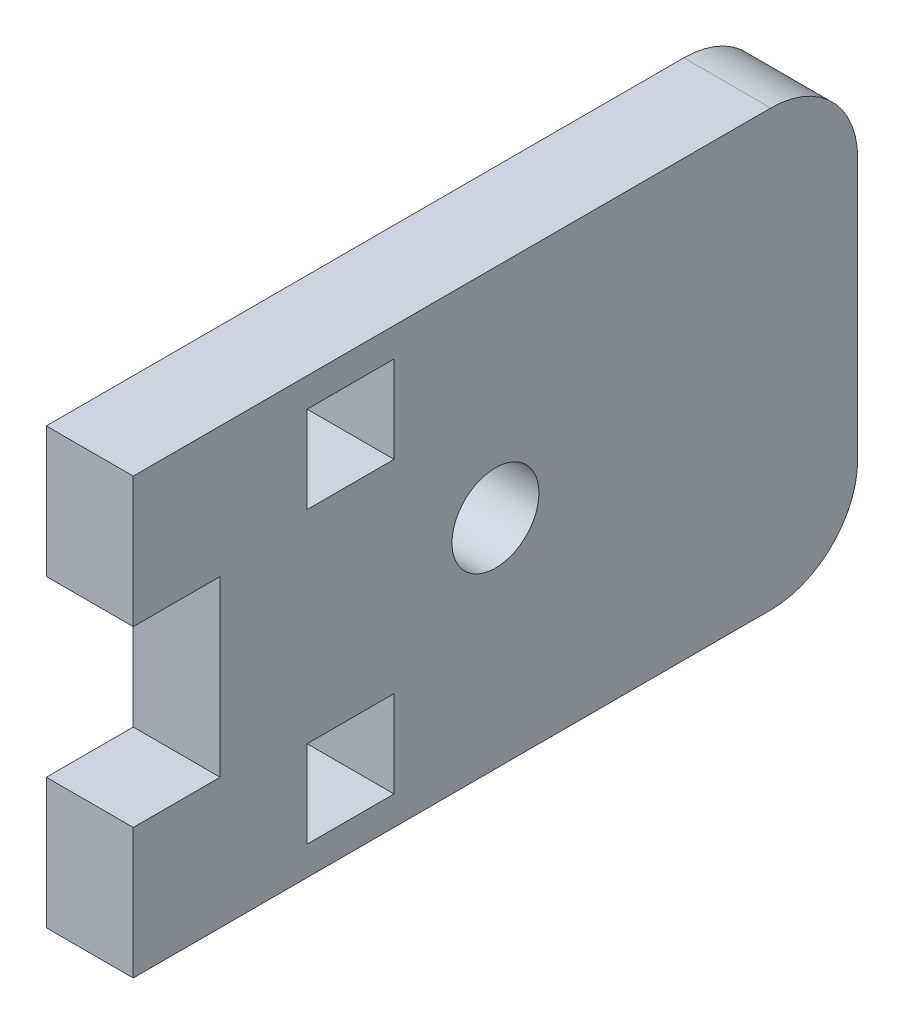
ISO-10303-21;
HEADER;
FILE_DESCRIPTION(('STEP AP214'),'2;1');
FILE_NAME('part.step','',(''),(''),'','','');
FILE_SCHEMA(('AUTOMOTIVE_DESIGN { 1 0 10303 214 1 1 1 1 }'));
ENDSEC;
DATA;
#1=APPLICATION_CONTEXT('core data for automotive mechanical design processes');
#2=APPLICATION_PROTOCOL_DEFINITION('international standard','automotive_design',2000,#1);
#3=PRODUCT_CONTEXT('',#1,'mechanical');
#4=PRODUCT('Part','Part','',(#3));
#5=PRODUCT_RELATED_PRODUCT_CATEGORY('part','',(#4));
#6=PRODUCT_DEFINITION_FORMATION('','',#4);
#7=PRODUCT_DEFINITION_CONTEXT('part definition',#1,'design');
#8=PRODUCT_DEFINITION('design','',#6,#7);
#9=PRODUCT_DEFINITION_SHAPE('','',#8);
#10=(LENGTH_UNIT() NAMED_UNIT(*) SI_UNIT(.MILLI.,.METRE.));
#11=(NAMED_UNIT(*) PLANE_ANGLE_UNIT() SI_UNIT($,.RADIAN.));
#12=(NAMED_UNIT(*) SI_UNIT($,.STERADIAN.) SOLID_ANGLE_UNIT());
#13=UNCERTAINTY_MEASURE_WITH_UNIT(LENGTH_MEASURE(1.E-05),#10,'distance_accuracy_value','');
#14=(GEOMETRIC_REPRESENTATION_CONTEXT(3) GLOBAL_UNCERTAINTY_ASSIGNED_CONTEXT((#13)) GLOBAL_UNIT_ASSIGNED_CONTEXT((#10,
#11,#12)) REPRESENTATION_CONTEXT('',''));
#15=CARTESIAN_POINT('',(0.,0.,0.));
#16=DIRECTION('',(0.,0.,1.));
#17=DIRECTION('',(1.,0.,0.));
#18=AXIS2_PLACEMENT_3D('',#15,#16,#17);
#19=CARTESIAN_POINT('',(3.,0.,0.));
#20=DIRECTION('',(1.,0.,0.));
#21=DIRECTION('',(0.,0.,-1.));
#22=AXIS2_PLACEMENT_3D('',#19,#20,#21);
#23=PLANE('',#22);
#24=DIRECTION('',(0.,0.,1.));
#25=VECTOR('',#24,1.);
#26=CARTESIAN_POINT('',(3.,-3.5,6.5));
#27=LINE('',#26,#25);
#28=CARTESIAN_POINT('',(3.,-3.5,3.5));
#29=VERTEX_POINT('',#28);
#30=CARTESIAN_POINT('',(3.,-3.5,6.5));
#31=VERTEX_POINT('',#30);
#32=EDGE_CURVE('E168',#29,#31,#27,.T.);
#33=ORIENTED_EDGE('',*,*,#32,.F.);
#34=DIRECTION('',(0.,1.,0.));
#35=VECTOR('',#34,1.);
#36=CARTESIAN_POINT('',(3.,-3.5,3.5));
#37=LINE('',#36,#35);
#38=CARTESIAN_POINT('',(3.,-6.5,3.5));
#39=VERTEX_POINT('',#38);
#40=EDGE_CURVE('E186',#39,#29,#37,.T.);
#41=ORIENTED_EDGE('',*,*,#40,.F.);
#42=DIRECTION('',(0.,0.,-1.));
#43=VECTOR('',#42,1.);
#44=CARTESIAN_POINT('',(3.,-6.5,6.5));
#45=LINE('',#44,#43);
#46=CARTESIAN_POINT('',(3.,-6.5,6.5));
#47=VERTEX_POINT('',#46);
#48=EDGE_CURVE('E189',#47,#39,#45,.T.);
#49=ORIENTED_EDGE('',*,*,#48,.F.);
#50=DIRECTION('',(0.,-1.,0.));
#51=VECTOR('',#50,1.);
#52=CARTESIAN_POINT('',(3.,-3.5,6.5));
#53=LINE('',#52,#51);
#54=EDGE_CURVE('E195',#31,#47,#53,.T.);
#55=ORIENTED_EDGE('',*,*,#54,.F.);
#56=EDGE_LOOP('',(#33,#41,#49,#55));
#57=FACE_BOUND('',#56,.T.);
#58=DIRECTION('',(0.,0.,1.));
#59=VECTOR('',#58,1.);
#60=CARTESIAN_POINT('',(3.,6.5,6.5));
#61=LINE('',#60,#59);
#62=CARTESIAN_POINT('',(3.,6.5,3.5));
#63=VERTEX_POINT('',#62);
#64=CARTESIAN_POINT('',(3.,6.5,6.5));
#65=VERTEX_POINT('',#64);
#66=EDGE_CURVE('E201',#63,#65,#61,.T.);
#67=ORIENTED_EDGE('',*,*,#66,.F.);
#68=DIRECTION('',(0.,1.,0.));
#69=VECTOR('',#68,1.);
#70=CARTESIAN_POINT('',(3.,6.5,3.5));
#71=LINE('',#70,#69);
#72=CARTESIAN_POINT('',(3.,3.5,3.5));
#73=VERTEX_POINT('',#72);
#74=EDGE_CURVE('E209',#73,#63,#71,.T.);
#75=ORIENTED_EDGE('',*,*,#74,.F.);
#76=DIRECTION('',(0.,0.,-1.));
#77=VECTOR('',#76,1.);
#78=CARTESIAN_POINT('',(3.,3.5,6.5));
#79=LINE('',#78,#77);
#80=CARTESIAN_POINT('',(3.,3.5,6.5));
#81=VERTEX_POINT('',#80);
#82=EDGE_CURVE('E223',#81,#73,#79,.T.);
#83=ORIENTED_EDGE('',*,*,#82,.F.);
#84=DIRECTION('',(0.,-1.,0.));
#85=VECTOR('',#84,1.);
#86=CARTESIAN_POINT('',(3.,6.5,6.5));
#87=LINE('',#86,#85);
#88=EDGE_CURVE('E220',#65,#81,#87,.T.);
#89=ORIENTED_EDGE('',*,*,#88,.F.);
#90=EDGE_LOOP('',(#67,#75,#83,#89));
#91=FACE_BOUND('',#90,.T.);
#92=DIRECTION('',(0.,0.,-1.));
#93=VECTOR('',#92,1.);
#94=CARTESIAN_POINT('',(3.,-7.5,12.5));
#95=LINE('',#94,#93);
#96=CARTESIAN_POINT('',(3.,-7.5,12.5));
#97=VERTEX_POINT('',#96);
#98=CARTESIAN_POINT('',(3.,-7.5,-9.5));
#99=VERTEX_POINT('',#98);
#100=EDGE_CURVE('E258',#97,#99,#95,.T.);
#101=ORIENTED_EDGE('',*,*,#100,.T.);
#102=CARTESIAN_POINT('',(3.,-4.5,-9.5));
#103=DIRECTION('',(1.,0.,0.));
#104=DIRECTION('',(0.,0.,-1.));
#105=AXIS2_PLACEMENT_3D('',#102,#103,#104);
#106=CIRCLE('',#105,3.);
#107=CARTESIAN_POINT('',(3.,-4.5,-12.5));
#108=VERTEX_POINT('',#107);
#109=EDGE_CURVE('E41',#99,#108,#106,.T.);
#110=ORIENTED_EDGE('',*,*,#109,.T.);
#111=DIRECTION('',(0.,1.,0.));
#112=VECTOR('',#111,1.);
#113=CARTESIAN_POINT('',(3.,7.5,-12.5));
#114=LINE('',#113,#112);
#115=CARTESIAN_POINT('',(3.,4.5,-12.5));
#116=VERTEX_POINT('',#115);
#117=EDGE_CURVE('E243',#108,#116,#114,.T.);
#118=ORIENTED_EDGE('',*,*,#117,.T.);
#119=CARTESIAN_POINT('',(3.,4.5,-9.5));
#120=DIRECTION('',(1.,0.,0.));
#121=DIRECTION('',(0.,0.,-1.));
#122=AXIS2_PLACEMENT_3D('',#119,#120,#121);
#123=CIRCLE('',#122,3.);
#124=CARTESIAN_POINT('',(3.,7.5,-9.5));
#125=VERTEX_POINT('',#124);
#126=EDGE_CURVE('E48',#116,#125,#123,.T.);
#127=ORIENTED_EDGE('',*,*,#126,.T.);
#128=DIRECTION('',(0.,0.,1.));
#129=VECTOR('',#128,1.);
#130=CARTESIAN_POINT('',(3.,7.5,12.5));
#131=LINE('',#130,#129);
#132=CARTESIAN_POINT('',(3.,7.5,12.5));
#133=VERTEX_POINT('',#132);
#134=EDGE_CURVE('E245',#125,#133,#131,.T.);
#135=ORIENTED_EDGE('',*,*,#134,.T.);
#136=DIRECTION('',(0.,-1.,0.));
#137=VECTOR('',#136,1.);
#138=CARTESIAN_POINT('',(3.,3.,12.5));
#139=LINE('',#138,#137);
#140=CARTESIAN_POINT('',(3.,3.,12.5));
#141=VERTEX_POINT('',#140);
#142=EDGE_CURVE('E248',#133,#141,#139,.T.);
#143=ORIENTED_EDGE('',*,*,#142,.T.);
#144=DIRECTION('',(0.,0.,-1.));
#145=VECTOR('',#144,1.);
#146=CARTESIAN_POINT('',(3.,3.,9.50000000000001));
#147=LINE('',#146,#145);
#148=CARTESIAN_POINT('',(3.,3.,9.50000000000001));
#149=VERTEX_POINT('',#148);
#150=EDGE_CURVE('E250',#141,#149,#147,.T.);
#151=ORIENTED_EDGE('',*,*,#150,.T.);
#152=DIRECTION('',(0.,-1.,0.));
#153=VECTOR('',#152,1.);
#154=CARTESIAN_POINT('',(3.,-3.,9.50000000000001));
#155=LINE('',#154,#153);
#156=CARTESIAN_POINT('',(3.,-3.,9.50000000000001));
#157=VERTEX_POINT('',#156);
#158=EDGE_CURVE('E252',#149,#157,#155,.T.);
#159=ORIENTED_EDGE('',*,*,#158,.T.);
#160=DIRECTION('',(0.,0.,1.));
#161=VECTOR('',#160,1.);
#162=CARTESIAN_POINT('',(3.,-3.,12.5));
#163=LINE('',#162,#161);
#164=CARTESIAN_POINT('',(3.,-3.,12.5));
#165=VERTEX_POINT('',#164);
#166=EDGE_CURVE('E254',#157,#165,#163,.T.);
#167=ORIENTED_EDGE('',*,*,#166,.T.);
#168=DIRECTION('',(0.,-1.,0.));
#169=VECTOR('',#168,1.);
#170=CARTESIAN_POINT('',(3.,-7.5,12.5));
#171=LINE('',#170,#169);
#172=EDGE_CURVE('E256',#165,#97,#171,.T.);
#173=ORIENTED_EDGE('',*,*,#172,.T.);
#174=EDGE_LOOP('',(#101,#110,#118,#127,#135,#143,#151,#159,#167,#173));
#175=FACE_BOUND('',#174,.T.);
#176=CARTESIAN_POINT('',(3.,0.,0.));
#177=DIRECTION('',(1.,0.,0.));
#178=DIRECTION('',(0.,0.,-1.));
#179=AXIS2_PLACEMENT_3D('',#176,#177,#178);
#180=CIRCLE('',#179,1.5);
#181=CARTESIAN_POINT('',(3.,0.,-1.5));
#182=VERTEX_POINT('',#181);
#183=EDGE_CURVE('E237',#182,#182,#180,.T.);
#184=ORIENTED_EDGE('',*,*,#183,.F.);
#185=EDGE_LOOP('',(#184));
#186=FACE_BOUND('',#185,.T.);
#187=ADVANCED_FACE('F33',(#57,#91,#175,#186),#23,.T.);
#188=CARTESIAN_POINT('',(0.,0.,0.));
#189=DIRECTION('',(1.,0.,0.));
#190=DIRECTION('',(0.,0.,-1.));
#191=AXIS2_PLACEMENT_3D('',#188,#189,#190);
#192=PLANE('',#191);
#193=DIRECTION('',(0.,1.,0.));
#194=VECTOR('',#193,1.);
#195=CARTESIAN_POINT('',(0.,-3.5,3.5));
#196=LINE('',#195,#194);
#197=CARTESIAN_POINT('',(0.,-6.5,3.5));
#198=VERTEX_POINT('',#197);
#199=CARTESIAN_POINT('',(0.,-3.5,3.5));
#200=VERTEX_POINT('',#199);
#201=EDGE_CURVE('E173',#198,#200,#196,.T.);
#202=ORIENTED_EDGE('',*,*,#201,.T.);
#203=DIRECTION('',(0.,0.,1.));
#204=VECTOR('',#203,1.);
#205=CARTESIAN_POINT('',(0.,-3.5,6.5));
#206=LINE('',#205,#204);
#207=CARTESIAN_POINT('',(0.,-3.5,6.5));
#208=VERTEX_POINT('',#207);
#209=EDGE_CURVE('E165',#200,#208,#206,.T.);
#210=ORIENTED_EDGE('',*,*,#209,.T.);
#211=DIRECTION('',(0.,-1.,0.));
#212=VECTOR('',#211,1.);
#213=CARTESIAN_POINT('',(0.,-3.5,6.5));
#214=LINE('',#213,#212);
#215=CARTESIAN_POINT('',(0.,-6.5,6.5));
#216=VERTEX_POINT('',#215);
#217=EDGE_CURVE('E177',#208,#216,#214,.T.);
#218=ORIENTED_EDGE('',*,*,#217,.T.);
#219=DIRECTION('',(0.,0.,-1.));
#220=VECTOR('',#219,1.);
#221=CARTESIAN_POINT('',(0.,-6.5,6.5));
#222=LINE('',#221,#220);
#223=EDGE_CURVE('E181',#216,#198,#222,.T.);
#224=ORIENTED_EDGE('',*,*,#223,.T.);
#225=EDGE_LOOP('',(#202,#210,#218,#224));
#226=FACE_BOUND('',#225,.T.);
#227=DIRECTION('',(0.,1.,0.));
#228=VECTOR('',#227,1.);
#229=CARTESIAN_POINT('',(0.,6.5,3.5));
#230=LINE('',#229,#228);
#231=CARTESIAN_POINT('',(0.,3.5,3.5));
#232=VERTEX_POINT('',#231);
#233=CARTESIAN_POINT('',(0.,6.5,3.5));
#234=VERTEX_POINT('',#233);
#235=EDGE_CURVE('E215',#232,#234,#230,.T.);
#236=ORIENTED_EDGE('',*,*,#235,.T.);
#237=DIRECTION('',(0.,0.,1.));
#238=VECTOR('',#237,1.);
#239=CARTESIAN_POINT('',(0.,6.5,6.5));
#240=LINE('',#239,#238);
#241=CARTESIAN_POINT('',(0.,6.5,6.5));
#242=VERTEX_POINT('',#241);
#243=EDGE_CURVE('E205',#234,#242,#240,.T.);
#244=ORIENTED_EDGE('',*,*,#243,.T.);
#245=DIRECTION('',(0.,-1.,0.));
#246=VECTOR('',#245,1.);
#247=CARTESIAN_POINT('',(0.,6.5,6.5));
#248=LINE('',#247,#246);
#249=CARTESIAN_POINT('',(0.,3.5,6.5));
#250=VERTEX_POINT('',#249);
#251=EDGE_CURVE('E208',#242,#250,#248,.T.);
#252=ORIENTED_EDGE('',*,*,#251,.T.);
#253=DIRECTION('',(0.,0.,-1.));
#254=VECTOR('',#253,1.);
#255=CARTESIAN_POINT('',(0.,3.5,6.5));
#256=LINE('',#255,#254);
#257=EDGE_CURVE('E212',#250,#232,#256,.T.);
#258=ORIENTED_EDGE('',*,*,#257,.T.);
#259=EDGE_LOOP('',(#236,#244,#252,#258));
#260=FACE_BOUND('',#259,.T.);
#261=DIRECTION('',(0.,1.,0.));
#262=VECTOR('',#261,1.);
#263=CARTESIAN_POINT('',(0.,7.5,-12.5));
#264=LINE('',#263,#262);
#265=CARTESIAN_POINT('',(0.,-4.5,-12.5));
#266=VERTEX_POINT('',#265);
#267=CARTESIAN_POINT('',(0.,4.5,-12.5));
#268=VERTEX_POINT('',#267);
#269=EDGE_CURVE('E240',#266,#268,#264,.T.);
#270=ORIENTED_EDGE('',*,*,#269,.F.);
#271=CARTESIAN_POINT('',(0.,-4.5,-9.5));
#272=DIRECTION('',(1.,0.,0.));
#273=DIRECTION('',(0.,0.,-1.));
#274=AXIS2_PLACEMENT_3D('',#271,#272,#273);
#275=CIRCLE('',#274,3.);
#276=CARTESIAN_POINT('',(0.,-7.5,-9.5));
#277=VERTEX_POINT('',#276);
#278=EDGE_CURVE('E300',#266,#277,#275,.F.);
#279=ORIENTED_EDGE('',*,*,#278,.T.);
#280=DIRECTION('',(0.,0.,-1.));
#281=VECTOR('',#280,1.);
#282=CARTESIAN_POINT('',(0.,-7.5,12.5));
#283=LINE('',#282,#281);
#284=CARTESIAN_POINT('',(0.,-7.5,12.5));
#285=VERTEX_POINT('',#284);
#286=EDGE_CURVE('E246',#285,#277,#283,.T.);
#287=ORIENTED_EDGE('',*,*,#286,.F.);
#288=DIRECTION('',(0.,-1.,0.));
#289=VECTOR('',#288,1.);
#290=CARTESIAN_POINT('',(0.,-7.5,12.5));
#291=LINE('',#290,#289);
#292=CARTESIAN_POINT('',(0.,-3.,12.5));
#293=VERTEX_POINT('',#292);
#294=EDGE_CURVE('E273',#293,#285,#291,.T.);
#295=ORIENTED_EDGE('',*,*,#294,.F.);
#296=DIRECTION('',(0.,0.,1.));
#297=VECTOR('',#296,1.);
#298=CARTESIAN_POINT('',(0.,-3.,12.5));
#299=LINE('',#298,#297);
#300=CARTESIAN_POINT('',(0.,-3.,9.50000000000001));
#301=VERTEX_POINT('',#300);
#302=EDGE_CURVE('E271',#301,#293,#299,.T.);
#303=ORIENTED_EDGE('',*,*,#302,.F.);
#304=DIRECTION('',(0.,-1.,0.));
#305=VECTOR('',#304,1.);
#306=CARTESIAN_POINT('',(0.,-3.,9.50000000000001));
#307=LINE('',#306,#305);
#308=CARTESIAN_POINT('',(0.,3.,9.50000000000001));
#309=VERTEX_POINT('',#308);
#310=EDGE_CURVE('E269',#309,#301,#307,.T.);
#311=ORIENTED_EDGE('',*,*,#310,.F.);
#312=DIRECTION('',(0.,0.,-1.));
#313=VECTOR('',#312,1.);
#314=CARTESIAN_POINT('',(0.,3.,9.50000000000001));
#315=LINE('',#314,#313);
#316=CARTESIAN_POINT('',(0.,3.,12.5));
#317=VERTEX_POINT('',#316);
#318=EDGE_CURVE('E267',#317,#309,#315,.T.);
#319=ORIENTED_EDGE('',*,*,#318,.F.);
#320=DIRECTION('',(0.,-1.,0.));
#321=VECTOR('',#320,1.);
#322=CARTESIAN_POINT('',(0.,3.,12.5));
#323=LINE('',#322,#321);
#324=CARTESIAN_POINT('',(0.,7.5,12.5));
#325=VERTEX_POINT('',#324);
#326=EDGE_CURVE('E265',#325,#317,#323,.T.);
#327=ORIENTED_EDGE('',*,*,#326,.F.);
#328=DIRECTION('',(0.,0.,1.));
#329=VECTOR('',#328,1.);
#330=CARTESIAN_POINT('',(0.,7.5,12.5));
#331=LINE('',#330,#329);
#332=CARTESIAN_POINT('',(0.,7.5,-9.5));
#333=VERTEX_POINT('',#332);
#334=EDGE_CURVE('E263',#333,#325,#331,.T.);
#335=ORIENTED_EDGE('',*,*,#334,.F.);
#336=CARTESIAN_POINT('',(0.,4.5,-9.5));
#337=DIRECTION('',(1.,0.,0.));
#338=DIRECTION('',(0.,0.,-1.));
#339=AXIS2_PLACEMENT_3D('',#336,#337,#338);
#340=CIRCLE('',#339,3.);
#341=EDGE_CURVE('E298',#333,#268,#340,.F.);
#342=ORIENTED_EDGE('',*,*,#341,.T.);
#343=EDGE_LOOP('',(#270,#279,#287,#295,#303,#311,#319,#327,#335,#342));
#344=FACE_BOUND('',#343,.T.);
#345=CARTESIAN_POINT('',(0.,0.,0.));
#346=DIRECTION('',(1.,0.,0.));
#347=DIRECTION('',(0.,0.,-1.));
#348=AXIS2_PLACEMENT_3D('',#345,#346,#347);
#349=CIRCLE('',#348,1.5);
#350=CARTESIAN_POINT('',(0.,0.,-1.5));
#351=VERTEX_POINT('',#350);
#352=EDGE_CURVE('E230',#351,#351,#349,.T.);
#353=ORIENTED_EDGE('',*,*,#352,.T.);
#354=EDGE_LOOP('',(#353));
#355=FACE_BOUND('',#354,.T.);
#356=ADVANCED_FACE('F183',(#226,#260,#344,#355),#192,.F.);
#357=CARTESIAN_POINT('',(3.,7.5,-12.5));
#358=DIRECTION('',(0.,0.,1.));
#359=DIRECTION('',(0.,-1.,0.));
#360=AXIS2_PLACEMENT_3D('',#357,#358,#359);
#361=PLANE('',#360);
#362=ORIENTED_EDGE('',*,*,#117,.F.);
#363=DIRECTION('',(-1.,0.,0.));
#364=VECTOR('',#363,1.);
#365=CARTESIAN_POINT('',(3.,-4.5,-12.5));
#366=LINE('',#365,#364);
#367=EDGE_CURVE('E295',#108,#266,#366,.T.);
#368=ORIENTED_EDGE('',*,*,#367,.T.);
#369=ORIENTED_EDGE('',*,*,#269,.T.);
#370=DIRECTION('',(-1.,0.,0.));
#371=VECTOR('',#370,1.);
#372=CARTESIAN_POINT('',(3.,4.5,-12.5));
#373=LINE('',#372,#371);
#374=EDGE_CURVE('E293',#268,#116,#373,.F.);
#375=ORIENTED_EDGE('',*,*,#374,.T.);
#376=EDGE_LOOP('',(#362,#368,#369,#375));
#377=FACE_BOUND('',#376,.T.);
#378=ADVANCED_FACE('F309',(#377),#361,.F.);
#379=CARTESIAN_POINT('',(3.,7.5,12.5));
#380=DIRECTION('',(0.,-1.,0.));
#381=DIRECTION('',(0.,0.,-1.));
#382=AXIS2_PLACEMENT_3D('',#379,#380,#381);
#383=PLANE('',#382);
#384=ORIENTED_EDGE('',*,*,#134,.F.);
#385=DIRECTION('',(-1.,0.,0.));
#386=VECTOR('',#385,1.);
#387=CARTESIAN_POINT('',(3.,7.5,-9.5));
#388=LINE('',#387,#386);
#389=EDGE_CURVE('E11',#125,#333,#388,.T.);
#390=ORIENTED_EDGE('',*,*,#389,.T.);
#391=ORIENTED_EDGE('',*,*,#334,.T.);
#392=DIRECTION('',(-1.,0.,0.));
#393=VECTOR('',#392,1.);
#394=CARTESIAN_POINT('',(3.,7.5,12.5));
#395=LINE('',#394,#393);
#396=EDGE_CURVE('E290',#133,#325,#395,.T.);
#397=ORIENTED_EDGE('',*,*,#396,.F.);
#398=EDGE_LOOP('',(#384,#390,#391,#397));
#399=FACE_BOUND('',#398,.T.);
#400=ADVANCED_FACE('F345',(#399),#383,.F.);
#401=CARTESIAN_POINT('',(3.,3.,12.5));
#402=DIRECTION('',(0.,0.,-1.));
#403=DIRECTION('',(-1.,0.,0.));
#404=AXIS2_PLACEMENT_3D('',#401,#402,#403);
#405=PLANE('',#404);
#406=ORIENTED_EDGE('',*,*,#326,.T.);
#407=DIRECTION('',(-1.,0.,0.));
#408=VECTOR('',#407,1.);
#409=CARTESIAN_POINT('',(3.,3.,12.5));
#410=LINE('',#409,#408);
#411=EDGE_CURVE('E287',#141,#317,#410,.T.);
#412=ORIENTED_EDGE('',*,*,#411,.F.);
#413=ORIENTED_EDGE('',*,*,#142,.F.);
#414=ORIENTED_EDGE('',*,*,#396,.T.);
#415=EDGE_LOOP('',(#406,#412,#413,#414));
#416=FACE_BOUND('',#415,.T.);
#417=ADVANCED_FACE('F341',(#416),#405,.F.);
#418=CARTESIAN_POINT('',(3.,3.,9.50000000000001));
#419=DIRECTION('',(0.,1.,0.));
#420=DIRECTION('',(0.,0.,1.));
#421=AXIS2_PLACEMENT_3D('',#418,#419,#420);
#422=PLANE('',#421);
#423=ORIENTED_EDGE('',*,*,#318,.T.);
#424=DIRECTION('',(-1.,0.,0.));
#425=VECTOR('',#424,1.);
#426=CARTESIAN_POINT('',(3.,3.,9.50000000000001));
#427=LINE('',#426,#425);
#428=EDGE_CURVE('E284',#149,#309,#427,.T.);
#429=ORIENTED_EDGE('',*,*,#428,.F.);
#430=ORIENTED_EDGE('',*,*,#150,.F.);
#431=ORIENTED_EDGE('',*,*,#411,.T.);
#432=EDGE_LOOP('',(#423,#429,#430,#431));
#433=FACE_BOUND('',#432,.T.);
#434=ADVANCED_FACE('F336',(#433),#422,.F.);
#435=CARTESIAN_POINT('',(3.,-3.,9.50000000000001));
#436=DIRECTION('',(0.,0.,-1.));
#437=DIRECTION('',(-1.,0.,0.));
#438=AXIS2_PLACEMENT_3D('',#435,#436,#437);
#439=PLANE('',#438);
#440=ORIENTED_EDGE('',*,*,#310,.T.);
#441=DIRECTION('',(-1.,0.,0.));
#442=VECTOR('',#441,1.);
#443=CARTESIAN_POINT('',(3.,-3.,9.50000000000001));
#444=LINE('',#443,#442);
#445=EDGE_CURVE('E281',#157,#301,#444,.T.);
#446=ORIENTED_EDGE('',*,*,#445,.F.);
#447=ORIENTED_EDGE('',*,*,#158,.F.);
#448=ORIENTED_EDGE('',*,*,#428,.T.);
#449=EDGE_LOOP('',(#440,#446,#447,#448));
#450=FACE_BOUND('',#449,.T.);
#451=ADVANCED_FACE('F332',(#450),#439,.F.);
#452=CARTESIAN_POINT('',(3.,-3.,12.5));
#453=DIRECTION('',(0.,-1.,0.));
#454=DIRECTION('',(0.,0.,-1.));
#455=AXIS2_PLACEMENT_3D('',#452,#453,#454);
#456=PLANE('',#455);
#457=ORIENTED_EDGE('',*,*,#302,.T.);
#458=DIRECTION('',(-1.,0.,0.));
#459=VECTOR('',#458,1.);
#460=CARTESIAN_POINT('',(3.,-3.,12.5));
#461=LINE('',#460,#459);
#462=EDGE_CURVE('E278',#165,#293,#461,.T.);
#463=ORIENTED_EDGE('',*,*,#462,.F.);
#464=ORIENTED_EDGE('',*,*,#166,.F.);
#465=ORIENTED_EDGE('',*,*,#445,.T.);
#466=EDGE_LOOP('',(#457,#463,#464,#465));
#467=FACE_BOUND('',#466,.T.);
#468=ADVANCED_FACE('F327',(#467),#456,.F.);
#469=CARTESIAN_POINT('',(3.,-7.5,12.5));
#470=DIRECTION('',(0.,0.,-1.));
#471=DIRECTION('',(-1.,0.,0.));
#472=AXIS2_PLACEMENT_3D('',#469,#470,#471);
#473=PLANE('',#472);
#474=ORIENTED_EDGE('',*,*,#294,.T.);
#475=DIRECTION('',(-1.,0.,0.));
#476=VECTOR('',#475,1.);
#477=CARTESIAN_POINT('',(3.,-7.5,12.5));
#478=LINE('',#477,#476);
#479=EDGE_CURVE('E260',#97,#285,#478,.T.);
#480=ORIENTED_EDGE('',*,*,#479,.F.);
#481=ORIENTED_EDGE('',*,*,#172,.F.);
#482=ORIENTED_EDGE('',*,*,#462,.T.);
#483=EDGE_LOOP('',(#474,#480,#481,#482));
#484=FACE_BOUND('',#483,.T.);
#485=ADVANCED_FACE('F321',(#484),#473,.F.);
#486=CARTESIAN_POINT('',(3.,-7.5,12.5));
#487=DIRECTION('',(0.,1.,0.));
#488=DIRECTION('',(0.,0.,1.));
#489=AXIS2_PLACEMENT_3D('',#486,#487,#488);
#490=PLANE('',#489);
#491=ORIENTED_EDGE('',*,*,#286,.T.);
#492=DIRECTION('',(-1.,0.,0.));
#493=VECTOR('',#492,1.);
#494=CARTESIAN_POINT('',(3.,-7.5,-9.5));
#495=LINE('',#494,#493);
#496=EDGE_CURVE('E56',#277,#99,#495,.F.);
#497=ORIENTED_EDGE('',*,*,#496,.T.);
#498=ORIENTED_EDGE('',*,*,#100,.F.);
#499=ORIENTED_EDGE('',*,*,#479,.T.);
#500=EDGE_LOOP('',(#491,#497,#498,#499));
#501=FACE_BOUND('',#500,.T.);
#502=ADVANCED_FACE('F317',(#501),#490,.F.);
#503=CARTESIAN_POINT('',(3.,0.,0.));
#504=DIRECTION('',(-1.,0.,0.));
#505=DIRECTION('',(0.,0.,1.));
#506=AXIS2_PLACEMENT_3D('',#503,#504,#505);
#507=CYLINDRICAL_SURFACE('',#506,1.5);
#508=ORIENTED_EDGE('',*,*,#183,.T.);
#509=EDGE_LOOP('',(#508));
#510=FACE_BOUND('',#509,.T.);
#511=ORIENTED_EDGE('',*,*,#352,.F.);
#512=EDGE_LOOP('',(#511));
#513=FACE_BOUND('',#512,.T.);
#514=ADVANCED_FACE('F361',(#510,#513),#507,.F.);
#515=CARTESIAN_POINT('',(0.,6.5,6.5));
#516=DIRECTION('',(0.,1.,0.));
#517=DIRECTION('',(0.,0.,1.));
#518=AXIS2_PLACEMENT_3D('',#515,#516,#517);
#519=PLANE('',#518);
#520=ORIENTED_EDGE('',*,*,#66,.T.);
#521=DIRECTION('',(1.,0.,0.));
#522=VECTOR('',#521,1.);
#523=CARTESIAN_POINT('',(0.,6.5,6.5));
#524=LINE('',#523,#522);
#525=EDGE_CURVE('E218',#242,#65,#524,.T.);
#526=ORIENTED_EDGE('',*,*,#525,.F.);
#527=ORIENTED_EDGE('',*,*,#243,.F.);
#528=DIRECTION('',(1.,0.,0.));
#529=VECTOR('',#528,1.);
#530=CARTESIAN_POINT('',(0.,6.5,3.5));
#531=LINE('',#530,#529);
#532=EDGE_CURVE('E228',#234,#63,#531,.T.);
#533=ORIENTED_EDGE('',*,*,#532,.T.);
#534=EDGE_LOOP('',(#520,#526,#527,#533));
#535=FACE_BOUND('',#534,.T.);
#536=ADVANCED_FACE('F418',(#535),#519,.F.);
#537=CARTESIAN_POINT('',(0.,6.5,3.5));
#538=DIRECTION('',(0.,0.,-1.));
#539=DIRECTION('',(-1.,0.,0.));
#540=AXIS2_PLACEMENT_3D('',#537,#538,#539);
#541=PLANE('',#540);
#542=ORIENTED_EDGE('',*,*,#74,.T.);
#543=ORIENTED_EDGE('',*,*,#532,.F.);
#544=ORIENTED_EDGE('',*,*,#235,.F.);
#545=DIRECTION('',(1.,0.,0.));
#546=VECTOR('',#545,1.);
#547=CARTESIAN_POINT('',(0.,3.5,3.5));
#548=LINE('',#547,#546);
#549=EDGE_CURVE('E231',#232,#73,#548,.T.);
#550=ORIENTED_EDGE('',*,*,#549,.T.);
#551=EDGE_LOOP('',(#542,#543,#544,#550));
#552=FACE_BOUND('',#551,.T.);
#553=ADVANCED_FACE('F425',(#552),#541,.F.);
#554=CARTESIAN_POINT('',(0.,3.5,6.5));
#555=DIRECTION('',(0.,-1.,0.));
#556=DIRECTION('',(0.,0.,-1.));
#557=AXIS2_PLACEMENT_3D('',#554,#555,#556);
#558=PLANE('',#557);
#559=ORIENTED_EDGE('',*,*,#82,.T.);
#560=ORIENTED_EDGE('',*,*,#549,.F.);
#561=ORIENTED_EDGE('',*,*,#257,.F.);
#562=DIRECTION('',(1.,0.,0.));
#563=VECTOR('',#562,1.);
#564=CARTESIAN_POINT('',(0.,3.5,6.5));
#565=LINE('',#564,#563);
#566=EDGE_CURVE('E233',#250,#81,#565,.T.);
#567=ORIENTED_EDGE('',*,*,#566,.T.);
#568=EDGE_LOOP('',(#559,#560,#561,#567));
#569=FACE_BOUND('',#568,.T.);
#570=ADVANCED_FACE('F432',(#569),#558,.F.);
#571=CARTESIAN_POINT('',(0.,6.5,6.5));
#572=DIRECTION('',(0.,0.,1.));
#573=DIRECTION('',(0.,-1.,0.));
#574=AXIS2_PLACEMENT_3D('',#571,#572,#573);
#575=PLANE('',#574);
#576=ORIENTED_EDGE('',*,*,#88,.T.);
#577=ORIENTED_EDGE('',*,*,#566,.F.);
#578=ORIENTED_EDGE('',*,*,#251,.F.);
#579=ORIENTED_EDGE('',*,*,#525,.T.);
#580=EDGE_LOOP('',(#576,#577,#578,#579));
#581=FACE_BOUND('',#580,.T.);
#582=ADVANCED_FACE('F440',(#581),#575,.F.);
#583=CARTESIAN_POINT('',(0.,-3.5,6.5));
#584=DIRECTION('',(0.,1.,0.));
#585=DIRECTION('',(0.,0.,1.));
#586=AXIS2_PLACEMENT_3D('',#583,#584,#585);
#587=PLANE('',#586);
#588=ORIENTED_EDGE('',*,*,#32,.T.);
#589=DIRECTION('',(1.,0.,0.));
#590=VECTOR('',#589,1.);
#591=CARTESIAN_POINT('',(0.,-3.5,6.5));
#592=LINE('',#591,#590);
#593=EDGE_CURVE('E161',#208,#31,#592,.T.);
#594=ORIENTED_EDGE('',*,*,#593,.F.);
#595=ORIENTED_EDGE('',*,*,#209,.F.);
#596=DIRECTION('',(1.,0.,0.));
#597=VECTOR('',#596,1.);
#598=CARTESIAN_POINT('',(0.,-3.5,3.5));
#599=LINE('',#598,#597);
#600=EDGE_CURVE('E199',#200,#29,#599,.T.);
#601=ORIENTED_EDGE('',*,*,#600,.T.);
#602=EDGE_LOOP('',(#588,#594,#595,#601));
#603=FACE_BOUND('',#602,.T.);
#604=ADVANCED_FACE('F163',(#603),#587,.F.);
#605=CARTESIAN_POINT('',(0.,-3.5,3.5));
#606=DIRECTION('',(0.,0.,-1.));
#607=DIRECTION('',(0.,1.,0.));
#608=AXIS2_PLACEMENT_3D('',#605,#606,#607);
#609=PLANE('',#608);
#610=ORIENTED_EDGE('',*,*,#40,.T.);
#611=ORIENTED_EDGE('',*,*,#600,.F.);
#612=ORIENTED_EDGE('',*,*,#201,.F.);
#613=DIRECTION('',(1.,0.,0.));
#614=VECTOR('',#613,1.);
#615=CARTESIAN_POINT('',(0.,-6.5,3.5));
#616=LINE('',#615,#614);
#617=EDGE_CURVE('E202',#198,#39,#616,.T.);
#618=ORIENTED_EDGE('',*,*,#617,.T.);
#619=EDGE_LOOP('',(#610,#611,#612,#618));
#620=FACE_BOUND('',#619,.T.);
#621=ADVANCED_FACE('F455',(#620),#609,.F.);
#622=CARTESIAN_POINT('',(0.,-6.5,6.5));
#623=DIRECTION('',(0.,-1.,0.));
#624=DIRECTION('',(0.,0.,-1.));
#625=AXIS2_PLACEMENT_3D('',#622,#623,#624);
#626=PLANE('',#625);
#627=ORIENTED_EDGE('',*,*,#48,.T.);
#628=ORIENTED_EDGE('',*,*,#617,.F.);
#629=ORIENTED_EDGE('',*,*,#223,.F.);
#630=DIRECTION('',(1.,0.,0.));
#631=VECTOR('',#630,1.);
#632=CARTESIAN_POINT('',(0.,-6.5,6.5));
#633=LINE('',#632,#631);
#634=EDGE_CURVE('E172',#216,#47,#633,.T.);
#635=ORIENTED_EDGE('',*,*,#634,.T.);
#636=EDGE_LOOP('',(#627,#628,#629,#635));
#637=FACE_BOUND('',#636,.T.);
#638=ADVANCED_FACE('F462',(#637),#626,.F.);
#639=CARTESIAN_POINT('',(0.,-3.5,6.5));
#640=DIRECTION('',(0.,0.,1.));
#641=DIRECTION('',(0.,-1.,0.));
#642=AXIS2_PLACEMENT_3D('',#639,#640,#641);
#643=PLANE('',#642);
#644=ORIENTED_EDGE('',*,*,#54,.T.);
#645=ORIENTED_EDGE('',*,*,#634,.F.);
#646=ORIENTED_EDGE('',*,*,#217,.F.);
#647=ORIENTED_EDGE('',*,*,#593,.T.);
#648=EDGE_LOOP('',(#644,#645,#646,#647));
#649=FACE_BOUND('',#648,.T.);
#650=ADVANCED_FACE('F178',(#649),#643,.F.);
#651=CARTESIAN_POINT('',(3.,-4.5,-9.5));
#652=DIRECTION('',(-1.,0.,0.));
#653=DIRECTION('',(0.,0.,1.));
#654=AXIS2_PLACEMENT_3D('',#651,#652,#653);
#655=CYLINDRICAL_SURFACE('',#654,3.);
#656=ORIENTED_EDGE('',*,*,#109,.F.);
#657=ORIENTED_EDGE('',*,*,#496,.F.);
#658=ORIENTED_EDGE('',*,*,#278,.F.);
#659=ORIENTED_EDGE('',*,*,#367,.F.);
#660=EDGE_LOOP('',(#656,#657,#658,#659));
#661=FACE_BOUND('',#660,.T.);
#662=ADVANCED_FACE('F312',(#661),#655,.T.);
#663=CARTESIAN_POINT('',(3.,4.5,-9.5));
#664=DIRECTION('',(-1.,0.,0.));
#665=DIRECTION('',(0.,0.,1.));
#666=AXIS2_PLACEMENT_3D('',#663,#664,#665);
#667=CYLINDRICAL_SURFACE('',#666,3.);
#668=ORIENTED_EDGE('',*,*,#126,.F.);
#669=ORIENTED_EDGE('',*,*,#374,.F.);
#670=ORIENTED_EDGE('',*,*,#341,.F.);
#671=ORIENTED_EDGE('',*,*,#389,.F.);
#672=EDGE_LOOP('',(#668,#669,#670,#671));
#673=FACE_BOUND('',#672,.T.);
#674=ADVANCED_FACE('F35',(#673),#667,.T.);
#675=CLOSED_SHELL('',(#187,#356,#378,#400,#417,#434,#451,#468,#485,#502,#514,#536,#553,#570,
#582,#604,#621,#638,#650,#662,#674));
#676=MANIFOLD_SOLID_BREP('B2',#675);
#677=ADVANCED_BREP_SHAPE_REPRESENTATION('',(#18,#676),#14);
#678=SHAPE_DEFINITION_REPRESENTATION(#9,#677);
ENDSEC;
END-ISO-10303-21;
